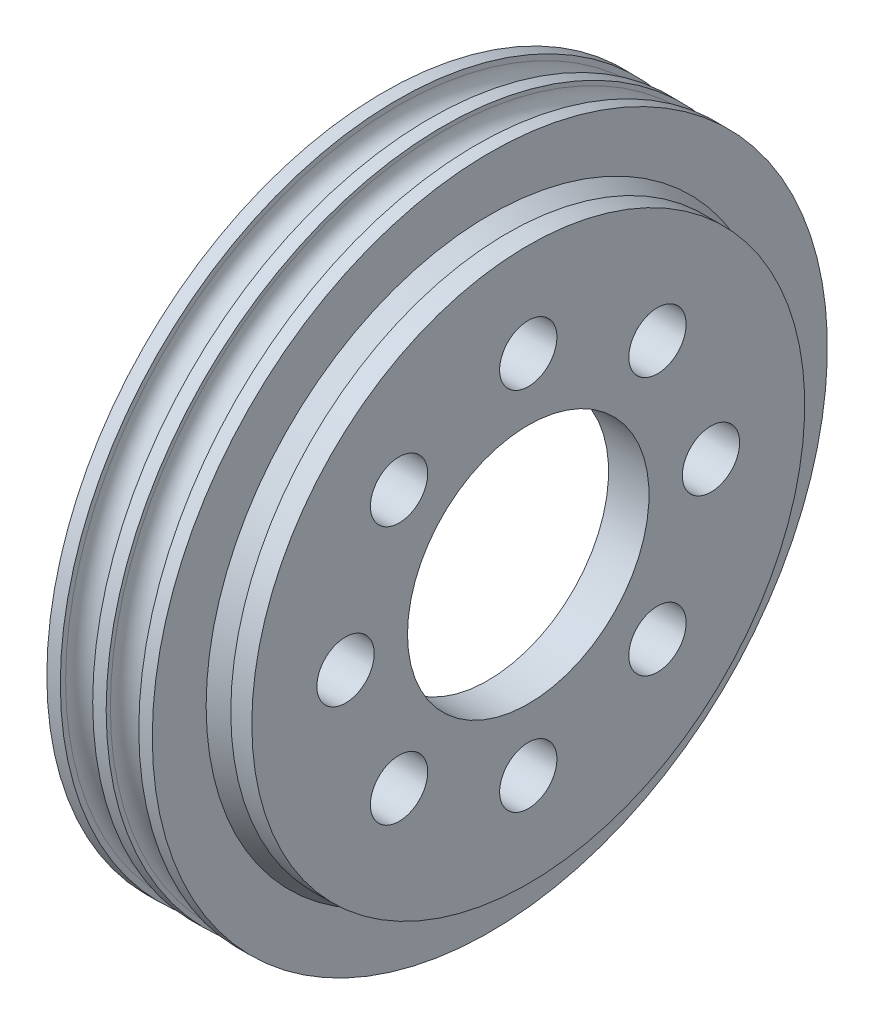
ISO-10303-21;
HEADER;
FILE_DESCRIPTION(('STEP AP214'),'2;1');
FILE_NAME('part.step','',(''),(''),'','','');
FILE_SCHEMA(('AUTOMOTIVE_DESIGN { 1 0 10303 214 1 1 1 1 }'));
ENDSEC;
DATA;
#1=APPLICATION_CONTEXT('core data for automotive mechanical design processes');
#2=APPLICATION_PROTOCOL_DEFINITION('international standard','automotive_design',2000,#1);
#3=PRODUCT_CONTEXT('',#1,'mechanical');
#4=PRODUCT('Part','Part','',(#3));
#5=PRODUCT_RELATED_PRODUCT_CATEGORY('part','',(#4));
#6=PRODUCT_DEFINITION_FORMATION('','',#4);
#7=PRODUCT_DEFINITION_CONTEXT('part definition',#1,'design');
#8=PRODUCT_DEFINITION('design','',#6,#7);
#9=PRODUCT_DEFINITION_SHAPE('','',#8);
#10=(LENGTH_UNIT() NAMED_UNIT(*) SI_UNIT(.MILLI.,.METRE.));
#11=(NAMED_UNIT(*) PLANE_ANGLE_UNIT() SI_UNIT($,.RADIAN.));
#12=(NAMED_UNIT(*) SI_UNIT($,.STERADIAN.) SOLID_ANGLE_UNIT());
#13=UNCERTAINTY_MEASURE_WITH_UNIT(LENGTH_MEASURE(1.E-05),#10,'distance_accuracy_value','');
#14=(GEOMETRIC_REPRESENTATION_CONTEXT(3) GLOBAL_UNCERTAINTY_ASSIGNED_CONTEXT((#13)) GLOBAL_UNIT_ASSIGNED_CONTEXT((#10,
#11,#12)) REPRESENTATION_CONTEXT('',''));
#15=CARTESIAN_POINT('',(0.,0.,0.));
#16=DIRECTION('',(0.,0.,1.));
#17=DIRECTION('',(1.,0.,0.));
#18=AXIS2_PLACEMENT_3D('',#15,#16,#17);
#19=CARTESIAN_POINT('',(-24.7571865671056,-45.2302228412257,0.));
#20=DIRECTION('',(-1.,0.,0.));
#21=DIRECTION('',(0.,0.,1.));
#22=AXIS2_PLACEMENT_3D('',#19,#20,#21);
#23=CYLINDRICAL_SURFACE('',#22,50.0619205916236);
#24=CARTESIAN_POINT('',(-0.743924059017714,-45.2302228412257,0.));
#25=DIRECTION('',(-1.,0.,0.));
#26=DIRECTION('',(0.,0.,1.));
#27=AXIS2_PLACEMENT_3D('',#24,#25,#26);
#28=CIRCLE('',#27,50.0619205916236);
#29=CARTESIAN_POINT('',(-0.743924059017714,-45.2302228412257,50.0619205916236));
#30=VERTEX_POINT('',#29);
#31=EDGE_CURVE('E84',#30,#30,#28,.T.);
#32=ORIENTED_EDGE('',*,*,#31,.F.);
#33=EDGE_LOOP('',(#32));
#34=FACE_BOUND('',#33,.T.);
#35=CARTESIAN_POINT('',(1.25607594098229,-45.2302228412257,0.));
#36=DIRECTION('',(-1.,0.,0.));
#37=DIRECTION('',(0.,0.,1.));
#38=AXIS2_PLACEMENT_3D('',#35,#36,#37);
#39=CIRCLE('',#38,50.0619205916236);
#40=CARTESIAN_POINT('',(1.25607594098229,-45.2302228412257,50.0619205916236));
#41=VERTEX_POINT('',#40);
#42=EDGE_CURVE('E10',#41,#41,#39,.T.);
#43=ORIENTED_EDGE('',*,*,#42,.T.);
#44=EDGE_LOOP('',(#43));
#45=FACE_BOUND('',#44,.T.);
#46=ADVANCED_FACE('F29',(#34,#45),#23,.T.);
#47=CARTESIAN_POINT('',(1.25607594098229,4.83169775039795,0.));
#48=DIRECTION('',(-1.,0.,0.));
#49=DIRECTION('',(0.,0.,1.));
#50=AXIS2_PLACEMENT_3D('',#47,#48,#49);
#51=PLANE('',#50);
#52=ORIENTED_EDGE('',*,*,#42,.F.);
#53=EDGE_LOOP('',(#52));
#54=FACE_BOUND('',#53,.T.);
#55=CARTESIAN_POINT('',(1.25607594098229,-45.2302228412257,0.));
#56=DIRECTION('',(-1.,0.,0.));
#57=DIRECTION('',(0.,0.,1.));
#58=AXIS2_PLACEMENT_3D('',#55,#56,#57);
#59=CIRCLE('',#58,42.0736581945583);
#60=CARTESIAN_POINT('',(1.25607594098229,-45.2302228412257,42.0736581945583));
#61=VERTEX_POINT('',#60);
#62=EDGE_CURVE('E35',#61,#61,#59,.T.);
#63=ORIENTED_EDGE('',*,*,#62,.T.);
#64=EDGE_LOOP('',(#63));
#65=FACE_BOUND('',#64,.T.);
#66=ADVANCED_FACE('F224',(#54,#65),#51,.F.);
#67=CARTESIAN_POINT('',(3.83593518708346,-45.2302228412257,0.));
#68=DIRECTION('',(-1.,0.,0.));
#69=DIRECTION('',(0.,0.,1.));
#70=AXIS2_PLACEMENT_3D('',#67,#68,#69);
#71=CONICAL_SURFACE('',#70,41.,0.394367245897445);
#72=ORIENTED_EDGE('',*,*,#62,.F.);
#73=EDGE_LOOP('',(#72));
#74=FACE_BOUND('',#73,.T.);
#75=CARTESIAN_POINT('',(3.83593518708346,-45.2302228412257,0.));
#76=DIRECTION('',(-1.,0.,0.));
#77=DIRECTION('',(0.,0.,1.));
#78=AXIS2_PLACEMENT_3D('',#75,#76,#77);
#79=CIRCLE('',#78,41.);
#80=CARTESIAN_POINT('',(3.83593518708346,-45.2302228412257,41.));
#81=VERTEX_POINT('',#80);
#82=EDGE_CURVE('E39',#81,#81,#79,.T.);
#83=ORIENTED_EDGE('',*,*,#82,.T.);
#84=EDGE_LOOP('',(#83));
#85=FACE_BOUND('',#84,.T.);
#86=ADVANCED_FACE('F228',(#74,#85),#71,.T.);
#87=CARTESIAN_POINT('',(-24.7571865671056,-45.2302228412257,0.));
#88=DIRECTION('',(-1.,0.,0.));
#89=DIRECTION('',(0.,0.,1.));
#90=AXIS2_PLACEMENT_3D('',#87,#88,#89);
#91=CYLINDRICAL_SURFACE('',#90,41.);
#92=ORIENTED_EDGE('',*,*,#82,.F.);
#93=EDGE_LOOP('',(#92));
#94=FACE_BOUND('',#93,.T.);
#95=CARTESIAN_POINT('',(6.95607594098228,-45.2302228412257,0.));
#96=DIRECTION('',(-1.,0.,0.));
#97=DIRECTION('',(0.,0.,1.));
#98=AXIS2_PLACEMENT_3D('',#95,#96,#97);
#99=CIRCLE('',#98,41.);
#100=CARTESIAN_POINT('',(6.95607594098228,-45.2302228412257,41.));
#101=VERTEX_POINT('',#100);
#102=EDGE_CURVE('E43',#101,#101,#99,.T.);
#103=ORIENTED_EDGE('',*,*,#102,.T.);
#104=EDGE_LOOP('',(#103));
#105=FACE_BOUND('',#104,.T.);
#106=ADVANCED_FACE('F233',(#94,#105),#91,.T.);
#107=CARTESIAN_POINT('',(6.95607594098229,-27.318302249602,0.));
#108=DIRECTION('',(-1.,0.,0.));
#109=DIRECTION('',(0.,0.,1.));
#110=AXIS2_PLACEMENT_3D('',#107,#108,#109);
#111=PLANE('',#110);
#112=CARTESIAN_POINT('',(6.95607594098229,-26.0676290710704,-19.162593770156));
#113=DIRECTION('',(-1.,0.,0.));
#114=DIRECTION('',(0.,0.,1.));
#115=AXIS2_PLACEMENT_3D('',#112,#113,#114);
#116=CIRCLE('',#115,4.25000000000054);
#117=CARTESIAN_POINT('',(6.95607594098229,-26.0676290710704,-14.9125937701555));
#118=VERTEX_POINT('',#117);
#119=EDGE_CURVE('E129',#118,#118,#116,.T.);
#120=ORIENTED_EDGE('',*,*,#119,.T.);
#121=EDGE_LOOP('',(#120));
#122=FACE_BOUND('',#121,.T.);
#123=CARTESIAN_POINT('',(6.95607594098229,-45.2302228412257,-27.0999999999996));
#124=DIRECTION('',(-1.,0.,0.));
#125=DIRECTION('',(0.,0.,1.));
#126=AXIS2_PLACEMENT_3D('',#123,#124,#125);
#127=CIRCLE('',#126,4.25);
#128=CARTESIAN_POINT('',(6.95607594098229,-45.2302228412257,-22.8499999999996));
#129=VERTEX_POINT('',#128);
#130=EDGE_CURVE('E123',#129,#129,#127,.T.);
#131=ORIENTED_EDGE('',*,*,#130,.T.);
#132=EDGE_LOOP('',(#131));
#133=FACE_BOUND('',#132,.T.);
#134=CARTESIAN_POINT('',(6.95607594098229,-64.3928166113812,-19.162593770155));
#135=DIRECTION('',(-1.,0.,0.));
#136=DIRECTION('',(0.,0.,1.));
#137=AXIS2_PLACEMENT_3D('',#134,#135,#136);
#138=CIRCLE('',#137,4.25);
#139=CARTESIAN_POINT('',(6.95607594098229,-64.3928166113812,-14.912593770155));
#140=VERTEX_POINT('',#139);
#141=EDGE_CURVE('E117',#140,#140,#138,.T.);
#142=ORIENTED_EDGE('',*,*,#141,.T.);
#143=EDGE_LOOP('',(#142));
#144=FACE_BOUND('',#143,.T.);
#145=CARTESIAN_POINT('',(6.95607594098229,-72.3302228412257,5.71033877735244E-13));
#146=DIRECTION('',(-1.,0.,0.));
#147=DIRECTION('',(0.,0.,1.));
#148=AXIS2_PLACEMENT_3D('',#145,#146,#147);
#149=CIRCLE('',#148,4.25);
#150=CARTESIAN_POINT('',(6.95607594098229,-72.3302228412257,4.25000000000057));
#151=VERTEX_POINT('',#150);
#152=EDGE_CURVE('E111',#151,#151,#149,.T.);
#153=ORIENTED_EDGE('',*,*,#152,.T.);
#154=EDGE_LOOP('',(#153));
#155=FACE_BOUND('',#154,.T.);
#156=CARTESIAN_POINT('',(6.95607594098229,-64.3928166113809,19.162593770156));
#157=DIRECTION('',(-1.,0.,0.));
#158=DIRECTION('',(0.,0.,1.));
#159=AXIS2_PLACEMENT_3D('',#156,#157,#158);
#160=CIRCLE('',#159,4.25);
#161=CARTESIAN_POINT('',(6.95607594098229,-64.3928166113809,23.412593770156));
#162=VERTEX_POINT('',#161);
#163=EDGE_CURVE('E105',#162,#162,#160,.T.);
#164=ORIENTED_EDGE('',*,*,#163,.T.);
#165=EDGE_LOOP('',(#164));
#166=FACE_BOUND('',#165,.T.);
#167=CARTESIAN_POINT('',(6.95607594098229,-45.2302228412254,27.1000000000004));
#168=DIRECTION('',(-1.,0.,0.));
#169=DIRECTION('',(0.,0.,1.));
#170=AXIS2_PLACEMENT_3D('',#167,#168,#169);
#171=CIRCLE('',#170,4.25);
#172=CARTESIAN_POINT('',(6.95607594098229,-45.2302228412254,31.3500000000004));
#173=VERTEX_POINT('',#172);
#174=EDGE_CURVE('E99',#173,#173,#171,.T.);
#175=ORIENTED_EDGE('',*,*,#174,.T.);
#176=EDGE_LOOP('',(#175));
#177=FACE_BOUND('',#176,.T.);
#178=CARTESIAN_POINT('',(6.95607594098229,-26.06762907107,19.1625937701556));
#179=DIRECTION('',(-1.,0.,0.));
#180=DIRECTION('',(0.,0.,1.));
#181=AXIS2_PLACEMENT_3D('',#178,#179,#180);
#182=CIRCLE('',#181,4.25);
#183=CARTESIAN_POINT('',(6.95607594098229,-26.06762907107,23.4125937701556));
#184=VERTEX_POINT('',#183);
#185=EDGE_CURVE('E93',#184,#184,#182,.T.);
#186=ORIENTED_EDGE('',*,*,#185,.T.);
#187=EDGE_LOOP('',(#186));
#188=FACE_BOUND('',#187,.T.);
#189=CARTESIAN_POINT('',(6.95607594098229,-18.1302228412257,0.));
#190=DIRECTION('',(-1.,0.,0.));
#191=DIRECTION('',(0.,0.,1.));
#192=AXIS2_PLACEMENT_3D('',#189,#190,#191);
#193=CIRCLE('',#192,4.25);
#194=CARTESIAN_POINT('',(6.95607594098229,-18.1302228412257,4.25));
#195=VERTEX_POINT('',#194);
#196=EDGE_CURVE('E87',#195,#195,#193,.T.);
#197=ORIENTED_EDGE('',*,*,#196,.T.);
#198=EDGE_LOOP('',(#197));
#199=FACE_BOUND('',#198,.T.);
#200=ORIENTED_EDGE('',*,*,#102,.F.);
#201=EDGE_LOOP('',(#200));
#202=FACE_BOUND('',#201,.T.);
#203=CARTESIAN_POINT('',(6.95607594098228,-45.2302228412257,0.));
#204=DIRECTION('',(-1.,0.,0.));
#205=DIRECTION('',(0.,0.,1.));
#206=AXIS2_PLACEMENT_3D('',#203,#204,#205);
#207=CIRCLE('',#206,17.9119205916236);
#208=CARTESIAN_POINT('',(6.95607594098228,-45.2302228412257,17.9119205916236));
#209=VERTEX_POINT('',#208);
#210=EDGE_CURVE('E48',#209,#209,#207,.T.);
#211=ORIENTED_EDGE('',*,*,#210,.T.);
#212=EDGE_LOOP('',(#211));
#213=FACE_BOUND('',#212,.T.);
#214=ADVANCED_FACE('F239',(#122,#133,#144,#155,#166,#177,#188,#199,#202,#213),#111,.F.);
#215=CARTESIAN_POINT('',(-24.7571865671056,-45.2302228412257,0.));
#216=DIRECTION('',(-1.,0.,0.));
#217=DIRECTION('',(0.,0.,1.));
#218=AXIS2_PLACEMENT_3D('',#215,#216,#217);
#219=CYLINDRICAL_SURFACE('',#218,17.9119205916236);
#220=ORIENTED_EDGE('',*,*,#210,.F.);
#221=EDGE_LOOP('',(#220));
#222=FACE_BOUND('',#221,.T.);
#223=CARTESIAN_POINT('',(0.956075940982286,-45.2302228412257,0.));
#224=DIRECTION('',(-1.,0.,0.));
#225=DIRECTION('',(0.,0.,1.));
#226=AXIS2_PLACEMENT_3D('',#223,#224,#225);
#227=CIRCLE('',#226,17.9119205916236);
#228=CARTESIAN_POINT('',(0.956075940982286,-45.2302228412257,17.9119205916236));
#229=VERTEX_POINT('',#228);
#230=EDGE_CURVE('E51',#229,#229,#227,.T.);
#231=ORIENTED_EDGE('',*,*,#230,.T.);
#232=EDGE_LOOP('',(#231));
#233=FACE_BOUND('',#232,.T.);
#234=ADVANCED_FACE('F143',(#222,#233),#219,.F.);
#235=CARTESIAN_POINT('',(0.956075940982286,-27.318302249602,0.));
#236=DIRECTION('',(1.,0.,0.));
#237=DIRECTION('',(0.,0.,-1.));
#238=AXIS2_PLACEMENT_3D('',#235,#236,#237);
#239=PLANE('',#238);
#240=CARTESIAN_POINT('',(0.956075940982286,-26.0676290710704,-19.162593770156));
#241=DIRECTION('',(-1.,0.,0.));
#242=DIRECTION('',(0.,0.,1.));
#243=AXIS2_PLACEMENT_3D('',#240,#241,#242);
#244=CIRCLE('',#243,4.25000000000054);
#245=CARTESIAN_POINT('',(0.956075940982286,-26.0676290710704,-14.9125937701555));
#246=VERTEX_POINT('',#245);
#247=EDGE_CURVE('E132',#246,#246,#244,.T.);
#248=ORIENTED_EDGE('',*,*,#247,.F.);
#249=EDGE_LOOP('',(#248));
#250=FACE_BOUND('',#249,.T.);
#251=CARTESIAN_POINT('',(0.956075940982286,-45.2302228412257,-27.0999999999996));
#252=DIRECTION('',(-1.,0.,0.));
#253=DIRECTION('',(0.,0.,1.));
#254=AXIS2_PLACEMENT_3D('',#251,#252,#253);
#255=CIRCLE('',#254,4.25);
#256=CARTESIAN_POINT('',(0.956075940982286,-45.2302228412257,-22.8499999999996));
#257=VERTEX_POINT('',#256);
#258=EDGE_CURVE('E126',#257,#257,#255,.T.);
#259=ORIENTED_EDGE('',*,*,#258,.F.);
#260=EDGE_LOOP('',(#259));
#261=FACE_BOUND('',#260,.T.);
#262=CARTESIAN_POINT('',(0.956075940982286,-64.3928166113812,-19.162593770155));
#263=DIRECTION('',(-1.,0.,0.));
#264=DIRECTION('',(0.,0.,1.));
#265=AXIS2_PLACEMENT_3D('',#262,#263,#264);
#266=CIRCLE('',#265,4.25);
#267=CARTESIAN_POINT('',(0.956075940982286,-64.3928166113812,-14.912593770155));
#268=VERTEX_POINT('',#267);
#269=EDGE_CURVE('E120',#268,#268,#266,.T.);
#270=ORIENTED_EDGE('',*,*,#269,.F.);
#271=EDGE_LOOP('',(#270));
#272=FACE_BOUND('',#271,.T.);
#273=CARTESIAN_POINT('',(0.956075940982286,-72.3302228412257,5.71033877735244E-13));
#274=DIRECTION('',(-1.,0.,0.));
#275=DIRECTION('',(0.,0.,1.));
#276=AXIS2_PLACEMENT_3D('',#273,#274,#275);
#277=CIRCLE('',#276,4.25);
#278=CARTESIAN_POINT('',(0.956075940982286,-72.3302228412257,4.25000000000057));
#279=VERTEX_POINT('',#278);
#280=EDGE_CURVE('E114',#279,#279,#277,.T.);
#281=ORIENTED_EDGE('',*,*,#280,.F.);
#282=EDGE_LOOP('',(#281));
#283=FACE_BOUND('',#282,.T.);
#284=CARTESIAN_POINT('',(0.956075940982286,-64.3928166113809,19.162593770156));
#285=DIRECTION('',(-1.,0.,0.));
#286=DIRECTION('',(0.,0.,1.));
#287=AXIS2_PLACEMENT_3D('',#284,#285,#286);
#288=CIRCLE('',#287,4.25);
#289=CARTESIAN_POINT('',(0.956075940982286,-64.3928166113809,23.412593770156));
#290=VERTEX_POINT('',#289);
#291=EDGE_CURVE('E108',#290,#290,#288,.T.);
#292=ORIENTED_EDGE('',*,*,#291,.F.);
#293=EDGE_LOOP('',(#292));
#294=FACE_BOUND('',#293,.T.);
#295=CARTESIAN_POINT('',(0.956075940982286,-45.2302228412254,27.1000000000004));
#296=DIRECTION('',(-1.,0.,0.));
#297=DIRECTION('',(0.,0.,1.));
#298=AXIS2_PLACEMENT_3D('',#295,#296,#297);
#299=CIRCLE('',#298,4.25);
#300=CARTESIAN_POINT('',(0.956075940982286,-45.2302228412254,31.3500000000004));
#301=VERTEX_POINT('',#300);
#302=EDGE_CURVE('E102',#301,#301,#299,.T.);
#303=ORIENTED_EDGE('',*,*,#302,.F.);
#304=EDGE_LOOP('',(#303));
#305=FACE_BOUND('',#304,.T.);
#306=CARTESIAN_POINT('',(0.956075940982286,-26.06762907107,19.1625937701556));
#307=DIRECTION('',(-1.,0.,0.));
#308=DIRECTION('',(0.,0.,1.));
#309=AXIS2_PLACEMENT_3D('',#306,#307,#308);
#310=CIRCLE('',#309,4.25);
#311=CARTESIAN_POINT('',(0.956075940982286,-26.06762907107,23.4125937701556));
#312=VERTEX_POINT('',#311);
#313=EDGE_CURVE('E96',#312,#312,#310,.T.);
#314=ORIENTED_EDGE('',*,*,#313,.F.);
#315=EDGE_LOOP('',(#314));
#316=FACE_BOUND('',#315,.T.);
#317=CARTESIAN_POINT('',(0.956075940982286,-18.1302228412257,0.));
#318=DIRECTION('',(-1.,0.,0.));
#319=DIRECTION('',(0.,0.,1.));
#320=AXIS2_PLACEMENT_3D('',#317,#318,#319);
#321=CIRCLE('',#320,4.25);
#322=CARTESIAN_POINT('',(0.956075940982286,-18.1302228412257,4.25));
#323=VERTEX_POINT('',#322);
#324=EDGE_CURVE('E90',#323,#323,#321,.T.);
#325=ORIENTED_EDGE('',*,*,#324,.F.);
#326=EDGE_LOOP('',(#325));
#327=FACE_BOUND('',#326,.T.);
#328=ORIENTED_EDGE('',*,*,#230,.F.);
#329=EDGE_LOOP('',(#328));
#330=FACE_BOUND('',#329,.T.);
#331=CARTESIAN_POINT('',(0.956075940982286,-45.2302228412257,0.));
#332=DIRECTION('',(-1.,0.,0.));
#333=DIRECTION('',(0.,0.,1.));
#334=AXIS2_PLACEMENT_3D('',#331,#332,#333);
#335=CIRCLE('',#334,36.);
#336=CARTESIAN_POINT('',(0.956075940982286,-45.2302228412257,36.));
#337=VERTEX_POINT('',#336);
#338=EDGE_CURVE('E54',#337,#337,#335,.T.);
#339=ORIENTED_EDGE('',*,*,#338,.T.);
#340=EDGE_LOOP('',(#339));
#341=FACE_BOUND('',#340,.T.);
#342=ADVANCED_FACE('F139',(#250,#261,#272,#283,#294,#305,#316,#327,#330,#341),#239,.F.);
#343=CARTESIAN_POINT('',(-14.4439240590177,-45.2302228412257,0.));
#344=DIRECTION('',(-1.,0.,0.));
#345=DIRECTION('',(0.,0.,1.));
#346=AXIS2_PLACEMENT_3D('',#343,#344,#345);
#347=CONICAL_SURFACE('',#346,43.9017869483155,0.474075015623964);
#348=ORIENTED_EDGE('',*,*,#338,.F.);
#349=EDGE_LOOP('',(#348));
#350=FACE_BOUND('',#349,.T.);
#351=CARTESIAN_POINT('',(-14.4439240590177,-45.2302228412257,0.));
#352=DIRECTION('',(-1.,0.,0.));
#353=DIRECTION('',(0.,0.,1.));
#354=AXIS2_PLACEMENT_3D('',#351,#352,#353);
#355=CIRCLE('',#354,43.9017869483155);
#356=CARTESIAN_POINT('',(-14.4439240590177,-45.2302228412257,43.9017869483155));
#357=VERTEX_POINT('',#356);
#358=EDGE_CURVE('E57',#357,#357,#355,.T.);
#359=ORIENTED_EDGE('',*,*,#358,.T.);
#360=EDGE_LOOP('',(#359));
#361=FACE_BOUND('',#360,.T.);
#362=ADVANCED_FACE('F142',(#350,#361),#347,.F.);
#363=CARTESIAN_POINT('',(-14.4439240590177,4.76977715877434,0.));
#364=DIRECTION('',(1.,0.,0.));
#365=DIRECTION('',(0.,0.,-1.));
#366=AXIS2_PLACEMENT_3D('',#363,#364,#365);
#367=PLANE('',#366);
#368=ORIENTED_EDGE('',*,*,#358,.F.);
#369=EDGE_LOOP('',(#368));
#370=FACE_BOUND('',#369,.T.);
#371=CARTESIAN_POINT('',(-14.4439240590177,-45.2302228412257,0.));
#372=DIRECTION('',(-1.,0.,0.));
#373=DIRECTION('',(0.,0.,1.));
#374=AXIS2_PLACEMENT_3D('',#371,#372,#373);
#375=CIRCLE('',#374,50.);
#376=CARTESIAN_POINT('',(-14.4439240590177,-45.2302228412257,50.));
#377=VERTEX_POINT('',#376);
#378=EDGE_CURVE('E60',#377,#377,#375,.T.);
#379=ORIENTED_EDGE('',*,*,#378,.T.);
#380=EDGE_LOOP('',(#379));
#381=FACE_BOUND('',#380,.T.);
#382=ADVANCED_FACE('F165',(#370,#381),#367,.F.);
#383=CARTESIAN_POINT('',(-24.7571865671056,-45.2302228412257,0.));
#384=DIRECTION('',(-1.,0.,0.));
#385=DIRECTION('',(0.,0.,1.));
#386=AXIS2_PLACEMENT_3D('',#383,#384,#385);
#387=CYLINDRICAL_SURFACE('',#386,50.);
#388=ORIENTED_EDGE('',*,*,#378,.F.);
#389=EDGE_LOOP('',(#388));
#390=FACE_BOUND('',#389,.T.);
#391=CARTESIAN_POINT('',(-12.4439240590177,-45.2302228412257,0.));
#392=DIRECTION('',(-1.,0.,0.));
#393=DIRECTION('',(0.,0.,1.));
#394=AXIS2_PLACEMENT_3D('',#391,#392,#393);
#395=CIRCLE('',#394,50.);
#396=CARTESIAN_POINT('',(-12.4439240590177,-45.2302228412257,50.));
#397=VERTEX_POINT('',#396);
#398=EDGE_CURVE('E63',#397,#397,#395,.T.);
#399=ORIENTED_EDGE('',*,*,#398,.T.);
#400=EDGE_LOOP('',(#399));
#401=FACE_BOUND('',#400,.T.);
#402=ADVANCED_FACE('F171',(#390,#401),#387,.T.);
#403=CARTESIAN_POINT('',(-12.4439240590177,4.76977715877434,0.));
#404=DIRECTION('',(-1.,0.,0.));
#405=DIRECTION('',(0.,0.,1.));
#406=AXIS2_PLACEMENT_3D('',#403,#404,#405);
#407=PLANE('',#406);
#408=ORIENTED_EDGE('',*,*,#398,.F.);
#409=EDGE_LOOP('',(#408));
#410=FACE_BOUND('',#409,.T.);
#411=CARTESIAN_POINT('',(-12.4439240590177,-45.2302228412257,0.));
#412=DIRECTION('',(-1.,0.,0.));
#413=DIRECTION('',(0.,0.,1.));
#414=AXIS2_PLACEMENT_3D('',#411,#412,#413);
#415=CIRCLE('',#414,49.2139760602775);
#416=CARTESIAN_POINT('',(-12.4439240590177,-45.2302228412257,49.2139760602775));
#417=VERTEX_POINT('',#416);
#418=EDGE_CURVE('E66',#417,#417,#415,.T.);
#419=ORIENTED_EDGE('',*,*,#418,.T.);
#420=EDGE_LOOP('',(#419));
#421=FACE_BOUND('',#420,.T.);
#422=ADVANCED_FACE('F177',(#410,#421),#407,.F.);
#423=CARTESIAN_POINT('',(-10.0439240590177,-45.2302228412257,0.));
#424=DIRECTION('',(-1.,0.,0.));
#425=DIRECTION('',(0.,0.,1.));
#426=AXIS2_PLACEMENT_3D('',#423,#424,#425);
#427=TOROIDAL_SURFACE('',#426,49.2139760602775,2.4);
#428=ORIENTED_EDGE('',*,*,#418,.F.);
#429=EDGE_LOOP('',(#428));
#430=FACE_BOUND('',#429,.T.);
#431=CARTESIAN_POINT('',(-7.64392405901772,-45.2302228412257,0.));
#432=DIRECTION('',(-1.,0.,0.));
#433=DIRECTION('',(0.,0.,1.));
#434=AXIS2_PLACEMENT_3D('',#431,#432,#433);
#435=CIRCLE('',#434,49.2139760602775);
#436=CARTESIAN_POINT('',(-7.64392405901772,-45.2302228412257,49.2139760602775));
#437=VERTEX_POINT('',#436);
#438=EDGE_CURVE('E69',#437,#437,#435,.T.);
#439=ORIENTED_EDGE('',*,*,#438,.T.);
#440=EDGE_LOOP('',(#439));
#441=FACE_BOUND('',#440,.T.);
#442=ADVANCED_FACE('F183',(#430,#441),#427,.F.);
#443=CARTESIAN_POINT('',(-7.64392405901772,3.98375321905186,0.));
#444=DIRECTION('',(1.,0.,0.));
#445=DIRECTION('',(0.,0.,-1.));
#446=AXIS2_PLACEMENT_3D('',#443,#444,#445);
#447=PLANE('',#446);
#448=ORIENTED_EDGE('',*,*,#438,.F.);
#449=EDGE_LOOP('',(#448));
#450=FACE_BOUND('',#449,.T.);
#451=CARTESIAN_POINT('',(-7.64392405901772,-45.2302228412257,0.));
#452=DIRECTION('',(-1.,0.,0.));
#453=DIRECTION('',(0.,0.,1.));
#454=AXIS2_PLACEMENT_3D('',#451,#452,#453);
#455=CIRCLE('',#454,50.);
#456=CARTESIAN_POINT('',(-7.64392405901772,-45.2302228412257,50.));
#457=VERTEX_POINT('',#456);
#458=EDGE_CURVE('E72',#457,#457,#455,.T.);
#459=ORIENTED_EDGE('',*,*,#458,.T.);
#460=EDGE_LOOP('',(#459));
#461=FACE_BOUND('',#460,.T.);
#462=ADVANCED_FACE('F189',(#450,#461),#447,.F.);
#463=CARTESIAN_POINT('',(-24.7571865671056,-45.2302228412257,0.));
#464=DIRECTION('',(-1.,0.,0.));
#465=DIRECTION('',(0.,0.,1.));
#466=AXIS2_PLACEMENT_3D('',#463,#464,#465);
#467=CYLINDRICAL_SURFACE('',#466,50.);
#468=ORIENTED_EDGE('',*,*,#458,.F.);
#469=EDGE_LOOP('',(#468));
#470=FACE_BOUND('',#469,.T.);
#471=CARTESIAN_POINT('',(-5.64392405901772,-45.2302228412257,0.));
#472=DIRECTION('',(-1.,0.,0.));
#473=DIRECTION('',(0.,0.,1.));
#474=AXIS2_PLACEMENT_3D('',#471,#472,#473);
#475=CIRCLE('',#474,50.);
#476=CARTESIAN_POINT('',(-5.64392405901772,-45.2302228412257,50.));
#477=VERTEX_POINT('',#476);
#478=EDGE_CURVE('E75',#477,#477,#475,.T.);
#479=ORIENTED_EDGE('',*,*,#478,.T.);
#480=EDGE_LOOP('',(#479));
#481=FACE_BOUND('',#480,.T.);
#482=ADVANCED_FACE('F195',(#470,#481),#467,.T.);
#483=CARTESIAN_POINT('',(-5.64392405901772,4.15038965049702,0.));
#484=DIRECTION('',(-1.,0.,0.));
#485=DIRECTION('',(0.,0.,1.));
#486=AXIS2_PLACEMENT_3D('',#483,#484,#485);
#487=PLANE('',#486);
#488=ORIENTED_EDGE('',*,*,#478,.F.);
#489=EDGE_LOOP('',(#488));
#490=FACE_BOUND('',#489,.T.);
#491=CARTESIAN_POINT('',(-5.64392405901772,-45.2302228412257,0.));
#492=DIRECTION('',(-1.,0.,0.));
#493=DIRECTION('',(0.,0.,1.));
#494=AXIS2_PLACEMENT_3D('',#491,#492,#493);
#495=CIRCLE('',#494,49.3806124917227);
#496=CARTESIAN_POINT('',(-5.64392405901772,-45.2302228412257,49.3806124917227));
#497=VERTEX_POINT('',#496);
#498=EDGE_CURVE('E78',#497,#497,#495,.T.);
#499=ORIENTED_EDGE('',*,*,#498,.T.);
#500=EDGE_LOOP('',(#499));
#501=FACE_BOUND('',#500,.T.);
#502=ADVANCED_FACE('F201',(#490,#501),#487,.F.);
#503=CARTESIAN_POINT('',(-3.19392405901771,-45.2302228412257,0.));
#504=DIRECTION('',(-1.,0.,0.));
#505=DIRECTION('',(0.,0.,1.));
#506=AXIS2_PLACEMENT_3D('',#503,#504,#505);
#507=TOROIDAL_SURFACE('',#506,49.3806124917227,2.45);
#508=ORIENTED_EDGE('',*,*,#498,.F.);
#509=EDGE_LOOP('',(#508));
#510=FACE_BOUND('',#509,.T.);
#511=CARTESIAN_POINT('',(-0.743924059017714,-45.2302228412257,0.));
#512=DIRECTION('',(-1.,0.,0.));
#513=DIRECTION('',(0.,0.,1.));
#514=AXIS2_PLACEMENT_3D('',#511,#512,#513);
#515=CIRCLE('',#514,49.3806124917227);
#516=CARTESIAN_POINT('',(-0.743924059017714,-45.2302228412257,49.3806124917227));
#517=VERTEX_POINT('',#516);
#518=EDGE_CURVE('E81',#517,#517,#515,.T.);
#519=ORIENTED_EDGE('',*,*,#518,.T.);
#520=EDGE_LOOP('',(#519));
#521=FACE_BOUND('',#520,.T.);
#522=ADVANCED_FACE('F207',(#510,#521),#507,.F.);
#523=CARTESIAN_POINT('',(-0.743924059017714,4.83169775039795,0.));
#524=DIRECTION('',(1.,0.,0.));
#525=DIRECTION('',(0.,0.,-1.));
#526=AXIS2_PLACEMENT_3D('',#523,#524,#525);
#527=PLANE('',#526);
#528=ORIENTED_EDGE('',*,*,#518,.F.);
#529=EDGE_LOOP('',(#528));
#530=FACE_BOUND('',#529,.T.);
#531=ORIENTED_EDGE('',*,*,#31,.T.);
#532=EDGE_LOOP('',(#531));
#533=FACE_BOUND('',#532,.T.);
#534=ADVANCED_FACE('F213',(#530,#533),#527,.F.);
#535=CARTESIAN_POINT('',(10.9560759409823,-18.1302228412257,0.));
#536=DIRECTION('',(-1.,0.,0.));
#537=DIRECTION('',(0.,0.,1.));
#538=AXIS2_PLACEMENT_3D('',#535,#536,#537);
#539=CYLINDRICAL_SURFACE('',#538,4.25);
#540=ORIENTED_EDGE('',*,*,#324,.T.);
#541=EDGE_LOOP('',(#540));
#542=FACE_BOUND('',#541,.T.);
#543=ORIENTED_EDGE('',*,*,#196,.F.);
#544=EDGE_LOOP('',(#543));
#545=FACE_BOUND('',#544,.T.);
#546=ADVANCED_FACE('F219',(#542,#545),#539,.F.);
#547=CARTESIAN_POINT('',(10.9560759409823,-26.06762907107,19.1625937701556));
#548=DIRECTION('',(-1.,0.,0.));
#549=DIRECTION('',(0.,0.,1.));
#550=AXIS2_PLACEMENT_3D('',#547,#548,#549);
#551=CYLINDRICAL_SURFACE('',#550,4.25);
#552=ORIENTED_EDGE('',*,*,#313,.T.);
#553=EDGE_LOOP('',(#552));
#554=FACE_BOUND('',#553,.T.);
#555=ORIENTED_EDGE('',*,*,#185,.F.);
#556=EDGE_LOOP('',(#555));
#557=FACE_BOUND('',#556,.T.);
#558=ADVANCED_FACE('F249',(#554,#557),#551,.F.);
#559=CARTESIAN_POINT('',(10.9560759409823,-45.2302228412254,27.1000000000004));
#560=DIRECTION('',(-1.,0.,0.));
#561=DIRECTION('',(0.,0.,1.));
#562=AXIS2_PLACEMENT_3D('',#559,#560,#561);
#563=CYLINDRICAL_SURFACE('',#562,4.25);
#564=ORIENTED_EDGE('',*,*,#302,.T.);
#565=EDGE_LOOP('',(#564));
#566=FACE_BOUND('',#565,.T.);
#567=ORIENTED_EDGE('',*,*,#174,.F.);
#568=EDGE_LOOP('',(#567));
#569=FACE_BOUND('',#568,.T.);
#570=ADVANCED_FACE('F253',(#566,#569),#563,.F.);
#571=CARTESIAN_POINT('',(10.9560759409823,-64.3928166113809,19.162593770156));
#572=DIRECTION('',(-1.,0.,0.));
#573=DIRECTION('',(0.,0.,1.));
#574=AXIS2_PLACEMENT_3D('',#571,#572,#573);
#575=CYLINDRICAL_SURFACE('',#574,4.25);
#576=ORIENTED_EDGE('',*,*,#291,.T.);
#577=EDGE_LOOP('',(#576));
#578=FACE_BOUND('',#577,.T.);
#579=ORIENTED_EDGE('',*,*,#163,.F.);
#580=EDGE_LOOP('',(#579));
#581=FACE_BOUND('',#580,.T.);
#582=ADVANCED_FACE('F257',(#578,#581),#575,.F.);
#583=CARTESIAN_POINT('',(10.9560759409823,-72.3302228412257,5.71033877735244E-13));
#584=DIRECTION('',(-1.,0.,0.));
#585=DIRECTION('',(0.,0.,1.));
#586=AXIS2_PLACEMENT_3D('',#583,#584,#585);
#587=CYLINDRICAL_SURFACE('',#586,4.25);
#588=ORIENTED_EDGE('',*,*,#280,.T.);
#589=EDGE_LOOP('',(#588));
#590=FACE_BOUND('',#589,.T.);
#591=ORIENTED_EDGE('',*,*,#152,.F.);
#592=EDGE_LOOP('',(#591));
#593=FACE_BOUND('',#592,.T.);
#594=ADVANCED_FACE('F261',(#590,#593),#587,.F.);
#595=CARTESIAN_POINT('',(10.9560759409823,-64.3928166113812,-19.162593770155));
#596=DIRECTION('',(-1.,0.,0.));
#597=DIRECTION('',(0.,0.,1.));
#598=AXIS2_PLACEMENT_3D('',#595,#596,#597);
#599=CYLINDRICAL_SURFACE('',#598,4.25);
#600=ORIENTED_EDGE('',*,*,#269,.T.);
#601=EDGE_LOOP('',(#600));
#602=FACE_BOUND('',#601,.T.);
#603=ORIENTED_EDGE('',*,*,#141,.F.);
#604=EDGE_LOOP('',(#603));
#605=FACE_BOUND('',#604,.T.);
#606=ADVANCED_FACE('F265',(#602,#605),#599,.F.);
#607=CARTESIAN_POINT('',(10.9560759409823,-45.2302228412257,-27.0999999999996));
#608=DIRECTION('',(-1.,0.,0.));
#609=DIRECTION('',(0.,0.,1.));
#610=AXIS2_PLACEMENT_3D('',#607,#608,#609);
#611=CYLINDRICAL_SURFACE('',#610,4.25);
#612=ORIENTED_EDGE('',*,*,#258,.T.);
#613=EDGE_LOOP('',(#612));
#614=FACE_BOUND('',#613,.T.);
#615=ORIENTED_EDGE('',*,*,#130,.F.);
#616=EDGE_LOOP('',(#615));
#617=FACE_BOUND('',#616,.T.);
#618=ADVANCED_FACE('F269',(#614,#617),#611,.F.);
#619=CARTESIAN_POINT('',(10.9560759409823,-26.0676290710704,-19.162593770156));
#620=DIRECTION('',(-1.,0.,0.));
#621=DIRECTION('',(0.,0.,1.));
#622=AXIS2_PLACEMENT_3D('',#619,#620,#621);
#623=CYLINDRICAL_SURFACE('',#622,4.25000000000054);
#624=ORIENTED_EDGE('',*,*,#247,.T.);
#625=EDGE_LOOP('',(#624));
#626=FACE_BOUND('',#625,.T.);
#627=ORIENTED_EDGE('',*,*,#119,.F.);
#628=EDGE_LOOP('',(#627));
#629=FACE_BOUND('',#628,.T.);
#630=ADVANCED_FACE('F136',(#626,#629),#623,.F.);
#631=CLOSED_SHELL('',(#46,#66,#86,#106,#214,#234,#342,#362,#382,#402,#422,#442,#462,#482,#502,
#522,#534,#546,#558,#570,#582,#594,#606,#618,#630));
#632=MANIFOLD_SOLID_BREP('B2',#631);
#633=ADVANCED_BREP_SHAPE_REPRESENTATION('',(#18,#632),#14);
#634=SHAPE_DEFINITION_REPRESENTATION(#9,#633);
ENDSEC;
END-ISO-10303-21;
